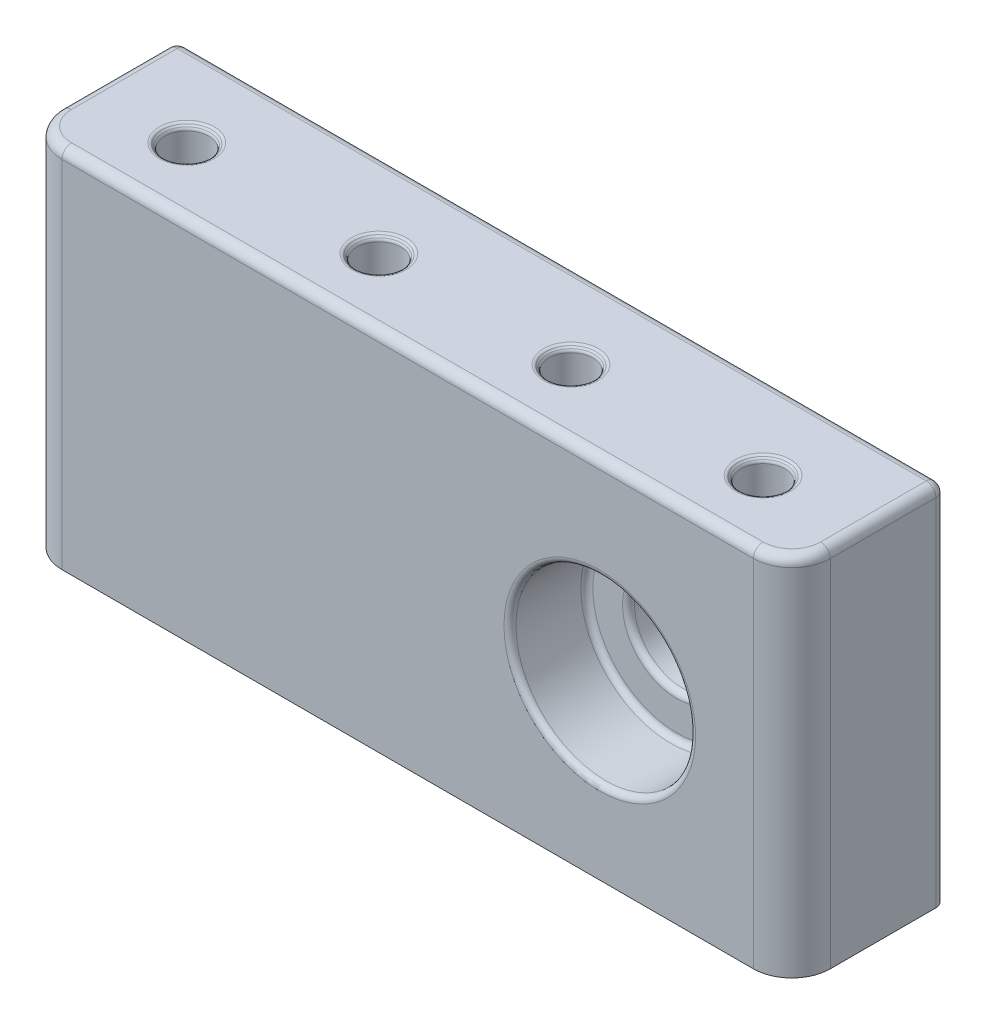
ISO-10303-21;
HEADER;
FILE_DESCRIPTION(('STEP AP214'),'2;1');
FILE_NAME('part.step','',(''),(''),'','','');
FILE_SCHEMA(('AUTOMOTIVE_DESIGN { 1 0 10303 214 1 1 1 1 }'));
ENDSEC;
DATA;
#1=APPLICATION_CONTEXT('core data for automotive mechanical design processes');
#2=APPLICATION_PROTOCOL_DEFINITION('international standard','automotive_design',2000,#1);
#3=PRODUCT_CONTEXT('',#1,'mechanical');
#4=PRODUCT('Part','Part','',(#3));
#5=PRODUCT_RELATED_PRODUCT_CATEGORY('part','',(#4));
#6=PRODUCT_DEFINITION_FORMATION('','',#4);
#7=PRODUCT_DEFINITION_CONTEXT('part definition',#1,'design');
#8=PRODUCT_DEFINITION('design','',#6,#7);
#9=PRODUCT_DEFINITION_SHAPE('','',#8);
#10=(LENGTH_UNIT() NAMED_UNIT(*) SI_UNIT(.MILLI.,.METRE.));
#11=(NAMED_UNIT(*) PLANE_ANGLE_UNIT() SI_UNIT($,.RADIAN.));
#12=(NAMED_UNIT(*) SI_UNIT($,.STERADIAN.) SOLID_ANGLE_UNIT());
#13=UNCERTAINTY_MEASURE_WITH_UNIT(LENGTH_MEASURE(1.E-05),#10,'distance_accuracy_value','');
#14=(GEOMETRIC_REPRESENTATION_CONTEXT(3) GLOBAL_UNCERTAINTY_ASSIGNED_CONTEXT((#13)) GLOBAL_UNIT_ASSIGNED_CONTEXT((#10,
#11,#12)) REPRESENTATION_CONTEXT('',''));
#15=CARTESIAN_POINT('',(0.,0.,0.));
#16=DIRECTION('',(0.,0.,1.));
#17=DIRECTION('',(1.,0.,0.));
#18=AXIS2_PLACEMENT_3D('',#15,#16,#17);
#19=CARTESIAN_POINT('',(20.,-9.5,8.));
#20=DIRECTION('',(-1.,0.,0.));
#21=DIRECTION('',(0.,0.,1.));
#22=AXIS2_PLACEMENT_3D('',#19,#20,#21);
#23=PLANE('',#22);
#24=DIRECTION('',(0.,1.,0.));
#25=VECTOR('',#24,1.);
#26=CARTESIAN_POINT('',(20.,9.5,0.5));
#27=LINE('',#26,#25);
#28=CARTESIAN_POINT('',(20.,-9.5,0.5));
#29=VERTEX_POINT('',#28);
#30=CARTESIAN_POINT('',(20.,9.,0.5));
#31=VERTEX_POINT('',#30);
#32=EDGE_CURVE('E248',#29,#31,#27,.T.);
#33=ORIENTED_EDGE('',*,*,#32,.T.);
#34=DIRECTION('',(0.,0.,-1.));
#35=VECTOR('',#34,1.);
#36=CARTESIAN_POINT('',(20.,9.,8.));
#37=LINE('',#36,#35);
#38=CARTESIAN_POINT('',(20.,9.,6.));
#39=VERTEX_POINT('',#38);
#40=EDGE_CURVE('E250',#31,#39,#37,.F.);
#41=ORIENTED_EDGE('',*,*,#40,.T.);
#42=DIRECTION('',(0.,1.,0.));
#43=VECTOR('',#42,1.);
#44=CARTESIAN_POINT('',(20.,-9.5,6.));
#45=LINE('',#44,#43);
#46=CARTESIAN_POINT('',(20.,-9.5,6.));
#47=VERTEX_POINT('',#46);
#48=EDGE_CURVE('E144',#39,#47,#45,.F.);
#49=ORIENTED_EDGE('',*,*,#48,.T.);
#50=DIRECTION('',(0.,0.,-1.));
#51=VECTOR('',#50,1.);
#52=CARTESIAN_POINT('',(20.,-9.5,8.));
#53=LINE('',#52,#51);
#54=EDGE_CURVE('E150',#47,#29,#53,.T.);
#55=ORIENTED_EDGE('',*,*,#54,.T.);
#56=EDGE_LOOP('',(#33,#41,#49,#55));
#57=FACE_BOUND('',#56,.T.);
#58=ADVANCED_FACE('F38',(#57),#23,.F.);
#59=CARTESIAN_POINT('',(-20.,9.5,8.));
#60=DIRECTION('',(0.,-1.,0.));
#61=DIRECTION('',(0.,0.,-1.));
#62=AXIS2_PLACEMENT_3D('',#59,#60,#61);
#63=PLANE('',#62);
#64=CARTESIAN_POINT('',(-18.,9.5,6.));
#65=DIRECTION('',(0.,-1.,0.));
#66=DIRECTION('',(0.,0.,-1.));
#67=AXIS2_PLACEMENT_3D('',#64,#65,#66);
#68=CIRCLE('',#67,1.5);
#69=CARTESIAN_POINT('',(-19.5,9.5,6.));
#70=VERTEX_POINT('',#69);
#71=CARTESIAN_POINT('',(-18.,9.5,7.5));
#72=VERTEX_POINT('',#71);
#73=EDGE_CURVE('E242',#70,#72,#68,.F.);
#74=ORIENTED_EDGE('',*,*,#73,.T.);
#75=DIRECTION('',(-1.,0.,0.));
#76=VECTOR('',#75,1.);
#77=CARTESIAN_POINT('',(-20.,9.5,7.5));
#78=LINE('',#77,#76);
#79=CARTESIAN_POINT('',(18.,9.5,7.5));
#80=VERTEX_POINT('',#79);
#81=EDGE_CURVE('E246',#72,#80,#78,.F.);
#82=ORIENTED_EDGE('',*,*,#81,.T.);
#83=CARTESIAN_POINT('',(18.,9.5,6.));
#84=DIRECTION('',(0.,-1.,0.));
#85=DIRECTION('',(0.,0.,-1.));
#86=AXIS2_PLACEMENT_3D('',#83,#84,#85);
#87=CIRCLE('',#86,1.5);
#88=CARTESIAN_POINT('',(19.5,9.5,6.));
#89=VERTEX_POINT('',#88);
#90=EDGE_CURVE('E244',#80,#89,#87,.F.);
#91=ORIENTED_EDGE('',*,*,#90,.T.);
#92=DIRECTION('',(0.,0.,-1.));
#93=VECTOR('',#92,1.);
#94=CARTESIAN_POINT('',(19.5,9.5,8.));
#95=LINE('',#94,#93);
#96=CARTESIAN_POINT('',(19.5,9.5,0.5));
#97=VERTEX_POINT('',#96);
#98=EDGE_CURVE('E239',#89,#97,#95,.T.);
#99=ORIENTED_EDGE('',*,*,#98,.T.);
#100=DIRECTION('',(-1.,0.,0.));
#101=VECTOR('',#100,1.);
#102=CARTESIAN_POINT('',(-20.,9.5,0.5));
#103=LINE('',#102,#101);
#104=CARTESIAN_POINT('',(-19.5,9.5,0.5));
#105=VERTEX_POINT('',#104);
#106=EDGE_CURVE('E235',#97,#105,#103,.T.);
#107=ORIENTED_EDGE('',*,*,#106,.T.);
#108=DIRECTION('',(0.,0.,-1.));
#109=VECTOR('',#108,1.);
#110=CARTESIAN_POINT('',(-19.5,9.5,8.));
#111=LINE('',#110,#109);
#112=EDGE_CURVE('E237',#105,#70,#111,.F.);
#113=ORIENTED_EDGE('',*,*,#112,.T.);
#114=EDGE_LOOP('',(#74,#82,#91,#99,#107,#113));
#115=FACE_BOUND('',#114,.T.);
#116=CARTESIAN_POINT('',(-15.,9.5,4.5));
#117=DIRECTION('',(0.,-1.,0.));
#118=DIRECTION('',(0.,0.,-1.));
#119=AXIS2_PLACEMENT_3D('',#116,#117,#118);
#120=CIRCLE('',#119,1.43284271247463);
#121=CARTESIAN_POINT('',(-15.,9.5,3.06715728752537));
#122=VERTEX_POINT('',#121);
#123=EDGE_CURVE('E196',#122,#122,#120,.T.);
#124=ORIENTED_EDGE('',*,*,#123,.T.);
#125=EDGE_LOOP('',(#124));
#126=FACE_BOUND('',#125,.T.);
#127=CARTESIAN_POINT('',(-5.,9.5,4.5));
#128=DIRECTION('',(0.,-1.,0.));
#129=DIRECTION('',(0.,0.,-1.));
#130=AXIS2_PLACEMENT_3D('',#127,#128,#129);
#131=CIRCLE('',#130,1.43284271247463);
#132=CARTESIAN_POINT('',(-5.,9.5,3.06715728752537));
#133=VERTEX_POINT('',#132);
#134=EDGE_CURVE('E193',#133,#133,#131,.T.);
#135=ORIENTED_EDGE('',*,*,#134,.T.);
#136=EDGE_LOOP('',(#135));
#137=FACE_BOUND('',#136,.T.);
#138=CARTESIAN_POINT('',(5.,9.5,4.5));
#139=DIRECTION('',(0.,-1.,0.));
#140=DIRECTION('',(0.,0.,-1.));
#141=AXIS2_PLACEMENT_3D('',#138,#139,#140);
#142=CIRCLE('',#141,1.43284271247463);
#143=CARTESIAN_POINT('',(5.,9.5,3.06715728752537));
#144=VERTEX_POINT('',#143);
#145=EDGE_CURVE('E190',#144,#144,#142,.T.);
#146=ORIENTED_EDGE('',*,*,#145,.T.);
#147=EDGE_LOOP('',(#146));
#148=FACE_BOUND('',#147,.T.);
#149=CARTESIAN_POINT('',(15.,9.5,4.5));
#150=DIRECTION('',(0.,-1.,0.));
#151=DIRECTION('',(0.,0.,-1.));
#152=AXIS2_PLACEMENT_3D('',#149,#150,#151);
#153=CIRCLE('',#152,1.43284271247463);
#154=CARTESIAN_POINT('',(15.,9.5,3.06715728752537));
#155=VERTEX_POINT('',#154);
#156=EDGE_CURVE('E187',#155,#155,#153,.T.);
#157=ORIENTED_EDGE('',*,*,#156,.T.);
#158=EDGE_LOOP('',(#157));
#159=FACE_BOUND('',#158,.T.);
#160=ADVANCED_FACE('F356',(#115,#126,#137,#148,#159),#63,.F.);
#161=CARTESIAN_POINT('',(-20.,-9.5,8.));
#162=DIRECTION('',(1.,0.,0.));
#163=DIRECTION('',(0.,0.,-1.));
#164=AXIS2_PLACEMENT_3D('',#161,#162,#163);
#165=PLANE('',#164);
#166=DIRECTION('',(0.,-1.,0.));
#167=VECTOR('',#166,1.);
#168=CARTESIAN_POINT('',(-20.,-9.5,6.));
#169=LINE('',#168,#167);
#170=CARTESIAN_POINT('',(-20.,-9.5,6.));
#171=VERTEX_POINT('',#170);
#172=CARTESIAN_POINT('',(-20.,9.,6.));
#173=VERTEX_POINT('',#172);
#174=EDGE_CURVE('E139',#171,#173,#169,.F.);
#175=ORIENTED_EDGE('',*,*,#174,.T.);
#176=DIRECTION('',(0.,0.,-1.));
#177=VECTOR('',#176,1.);
#178=CARTESIAN_POINT('',(-20.,9.,8.));
#179=LINE('',#178,#177);
#180=CARTESIAN_POINT('',(-20.,9.,0.5));
#181=VERTEX_POINT('',#180);
#182=EDGE_CURVE('E257',#173,#181,#179,.T.);
#183=ORIENTED_EDGE('',*,*,#182,.T.);
#184=DIRECTION('',(0.,-1.,0.));
#185=VECTOR('',#184,1.);
#186=CARTESIAN_POINT('',(-20.,-9.5,0.5));
#187=LINE('',#186,#185);
#188=CARTESIAN_POINT('',(-20.,-9.5,0.5));
#189=VERTEX_POINT('',#188);
#190=EDGE_CURVE('E255',#181,#189,#187,.T.);
#191=ORIENTED_EDGE('',*,*,#190,.T.);
#192=DIRECTION('',(0.,0.,-1.));
#193=VECTOR('',#192,1.);
#194=CARTESIAN_POINT('',(-20.,-9.5,8.));
#195=LINE('',#194,#193);
#196=EDGE_CURVE('E133',#171,#189,#195,.T.);
#197=ORIENTED_EDGE('',*,*,#196,.F.);
#198=EDGE_LOOP('',(#175,#183,#191,#197));
#199=FACE_BOUND('',#198,.T.);
#200=ADVANCED_FACE('F362',(#199),#165,.F.);
#201=CARTESIAN_POINT('',(-20.,-9.5,8.));
#202=DIRECTION('',(0.,1.,0.));
#203=DIRECTION('',(0.,0.,1.));
#204=AXIS2_PLACEMENT_3D('',#201,#202,#203);
#205=PLANE('',#204);
#206=DIRECTION('',(1.,0.,0.));
#207=VECTOR('',#206,1.);
#208=CARTESIAN_POINT('',(-20.,-9.5,0.));
#209=LINE('',#208,#207);
#210=CARTESIAN_POINT('',(-19.5,-9.5,0.));
#211=VERTEX_POINT('',#210);
#212=CARTESIAN_POINT('',(19.5,-9.5,0.));
#213=VERTEX_POINT('',#212);
#214=EDGE_CURVE('E151',#211,#213,#209,.T.);
#215=ORIENTED_EDGE('',*,*,#214,.T.);
#216=CARTESIAN_POINT('',(19.5,-9.5,0.5));
#217=DIRECTION('',(0.,1.,0.));
#218=DIRECTION('',(0.,0.,1.));
#219=AXIS2_PLACEMENT_3D('',#216,#217,#218);
#220=CIRCLE('',#219,0.5);
#221=EDGE_CURVE('E268',#213,#29,#220,.F.);
#222=ORIENTED_EDGE('',*,*,#221,.T.);
#223=ORIENTED_EDGE('',*,*,#54,.F.);
#224=CARTESIAN_POINT('',(18.,-9.5,6.));
#225=DIRECTION('',(0.,1.,0.));
#226=DIRECTION('',(0.,0.,1.));
#227=AXIS2_PLACEMENT_3D('',#224,#225,#226);
#228=CIRCLE('',#227,2.);
#229=CARTESIAN_POINT('',(18.,-9.5,8.));
#230=VERTEX_POINT('',#229);
#231=EDGE_CURVE('E143',#47,#230,#228,.F.);
#232=ORIENTED_EDGE('',*,*,#231,.T.);
#233=DIRECTION('',(1.,0.,0.));
#234=VECTOR('',#233,1.);
#235=CARTESIAN_POINT('',(-20.,-9.5,8.));
#236=LINE('',#235,#234);
#237=CARTESIAN_POINT('',(-18.,-9.5,8.));
#238=VERTEX_POINT('',#237);
#239=EDGE_CURVE('E126',#238,#230,#236,.T.);
#240=ORIENTED_EDGE('',*,*,#239,.F.);
#241=CARTESIAN_POINT('',(-18.,-9.5,6.));
#242=DIRECTION('',(0.,1.,0.));
#243=DIRECTION('',(0.,0.,1.));
#244=AXIS2_PLACEMENT_3D('',#241,#242,#243);
#245=CIRCLE('',#244,2.);
#246=EDGE_CURVE('E136',#238,#171,#245,.F.);
#247=ORIENTED_EDGE('',*,*,#246,.T.);
#248=ORIENTED_EDGE('',*,*,#196,.T.);
#249=CARTESIAN_POINT('',(-19.5,-9.5,0.5));
#250=DIRECTION('',(0.,1.,0.));
#251=DIRECTION('',(0.,0.,1.));
#252=AXIS2_PLACEMENT_3D('',#249,#250,#251);
#253=CIRCLE('',#252,0.5);
#254=EDGE_CURVE('E266',#189,#211,#253,.F.);
#255=ORIENTED_EDGE('',*,*,#254,.T.);
#256=EDGE_LOOP('',(#215,#222,#223,#232,#240,#247,#248,#255));
#257=FACE_BOUND('',#256,.T.);
#258=ADVANCED_FACE('F147',(#257),#205,.F.);
#259=CARTESIAN_POINT('',(0.,0.,8.));
#260=DIRECTION('',(0.,0.,-1.));
#261=DIRECTION('',(-1.,0.,0.));
#262=AXIS2_PLACEMENT_3D('',#259,#260,#261);
#263=PLANE('',#262);
#264=CARTESIAN_POINT('',(10.,-0.499999999999999,8.));
#265=DIRECTION('',(0.,0.,-1.));
#266=DIRECTION('',(-1.,0.,0.));
#267=AXIS2_PLACEMENT_3D('',#264,#265,#266);
#268=CIRCLE('',#267,4.9875);
#269=CARTESIAN_POINT('',(5.01250000000001,-0.499999999999999,8.));
#270=VERTEX_POINT('',#269);
#271=EDGE_CURVE('E11',#270,#270,#268,.T.);
#272=ORIENTED_EDGE('',*,*,#271,.T.);
#273=EDGE_LOOP('',(#272));
#274=FACE_BOUND('',#273,.T.);
#275=DIRECTION('',(0.,1.,0.));
#276=VECTOR('',#275,1.);
#277=CARTESIAN_POINT('',(18.,0.,8.));
#278=LINE('',#277,#276);
#279=CARTESIAN_POINT('',(18.,9.,8.));
#280=VERTEX_POINT('',#279);
#281=EDGE_CURVE('E132',#230,#280,#278,.T.);
#282=ORIENTED_EDGE('',*,*,#281,.T.);
#283=DIRECTION('',(-1.,0.,0.));
#284=VECTOR('',#283,1.);
#285=CARTESIAN_POINT('',(0.,9.,8.));
#286=LINE('',#285,#284);
#287=CARTESIAN_POINT('',(-18.,9.,8.));
#288=VERTEX_POINT('',#287);
#289=EDGE_CURVE('E129',#280,#288,#286,.T.);
#290=ORIENTED_EDGE('',*,*,#289,.T.);
#291=DIRECTION('',(0.,-1.,0.));
#292=VECTOR('',#291,1.);
#293=CARTESIAN_POINT('',(-18.,0.,8.));
#294=LINE('',#293,#292);
#295=EDGE_CURVE('E121',#288,#238,#294,.T.);
#296=ORIENTED_EDGE('',*,*,#295,.T.);
#297=ORIENTED_EDGE('',*,*,#239,.T.);
#298=EDGE_LOOP('',(#282,#290,#296,#297));
#299=FACE_BOUND('',#298,.T.);
#300=ADVANCED_FACE('F124',(#274,#299),#263,.F.);
#301=CARTESIAN_POINT('',(0.,0.,0.));
#302=DIRECTION('',(0.,0.,-1.));
#303=DIRECTION('',(-1.,0.,0.));
#304=AXIS2_PLACEMENT_3D('',#301,#302,#303);
#305=PLANE('',#304);
#306=CARTESIAN_POINT('',(10.,-0.499999999999999,0.));
#307=DIRECTION('',(0.,0.,-1.));
#308=DIRECTION('',(-1.,0.,0.));
#309=AXIS2_PLACEMENT_3D('',#306,#307,#308);
#310=CIRCLE('',#309,4.1294417382416);
#311=CARTESIAN_POINT('',(5.87055826175841,-0.499999999999999,0.));
#312=VERTEX_POINT('',#311);
#313=EDGE_CURVE('E270',#312,#312,#310,.F.);
#314=ORIENTED_EDGE('',*,*,#313,.T.);
#315=EDGE_LOOP('',(#314));
#316=FACE_BOUND('',#315,.T.);
#317=DIRECTION('',(-1.,0.,0.));
#318=VECTOR('',#317,1.);
#319=CARTESIAN_POINT('',(20.,9.,0.));
#320=LINE('',#319,#318);
#321=CARTESIAN_POINT('',(-19.5,9.,0.));
#322=VERTEX_POINT('',#321);
#323=CARTESIAN_POINT('',(19.5,9.,0.));
#324=VERTEX_POINT('',#323);
#325=EDGE_CURVE('E53',#322,#324,#320,.F.);
#326=ORIENTED_EDGE('',*,*,#325,.T.);
#327=DIRECTION('',(0.,1.,0.));
#328=VECTOR('',#327,1.);
#329=CARTESIAN_POINT('',(19.5,-9.5,0.));
#330=LINE('',#329,#328);
#331=EDGE_CURVE('E264',#324,#213,#330,.F.);
#332=ORIENTED_EDGE('',*,*,#331,.T.);
#333=ORIENTED_EDGE('',*,*,#214,.F.);
#334=DIRECTION('',(0.,-1.,0.));
#335=VECTOR('',#334,1.);
#336=CARTESIAN_POINT('',(-19.5,9.5,0.));
#337=LINE('',#336,#335);
#338=EDGE_CURVE('E58',#211,#322,#337,.F.);
#339=ORIENTED_EDGE('',*,*,#338,.T.);
#340=EDGE_LOOP('',(#326,#332,#333,#339));
#341=FACE_BOUND('',#340,.T.);
#342=ADVANCED_FACE('F370',(#316,#341),#305,.T.);
#343=CARTESIAN_POINT('',(18.,0.,6.));
#344=DIRECTION('',(0.,1.,0.));
#345=DIRECTION('',(0.,0.,1.));
#346=AXIS2_PLACEMENT_3D('',#343,#344,#345);
#347=CYLINDRICAL_SURFACE('',#346,2.);
#348=ORIENTED_EDGE('',*,*,#48,.F.);
#349=CARTESIAN_POINT('',(18.,9.,6.));
#350=DIRECTION('',(0.,-1.,0.));
#351=DIRECTION('',(0.,0.,-1.));
#352=AXIS2_PLACEMENT_3D('',#349,#350,#351);
#353=CIRCLE('',#352,2.);
#354=EDGE_CURVE('E253',#39,#280,#353,.T.);
#355=ORIENTED_EDGE('',*,*,#354,.T.);
#356=ORIENTED_EDGE('',*,*,#281,.F.);
#357=ORIENTED_EDGE('',*,*,#231,.F.);
#358=EDGE_LOOP('',(#348,#355,#356,#357));
#359=FACE_BOUND('',#358,.T.);
#360=ADVANCED_FACE('F367',(#359),#347,.T.);
#361=CARTESIAN_POINT('',(-18.,0.,6.));
#362=DIRECTION('',(0.,-1.,0.));
#363=DIRECTION('',(0.,0.,-1.));
#364=AXIS2_PLACEMENT_3D('',#361,#362,#363);
#365=CYLINDRICAL_SURFACE('',#364,2.);
#366=ORIENTED_EDGE('',*,*,#295,.F.);
#367=CARTESIAN_POINT('',(-18.,9.,6.));
#368=DIRECTION('',(0.,-1.,0.));
#369=DIRECTION('',(0.,0.,-1.));
#370=AXIS2_PLACEMENT_3D('',#367,#368,#369);
#371=CIRCLE('',#370,2.);
#372=EDGE_CURVE('E259',#288,#173,#371,.T.);
#373=ORIENTED_EDGE('',*,*,#372,.T.);
#374=ORIENTED_EDGE('',*,*,#174,.F.);
#375=ORIENTED_EDGE('',*,*,#246,.F.);
#376=EDGE_LOOP('',(#366,#373,#374,#375));
#377=FACE_BOUND('',#376,.T.);
#378=ADVANCED_FACE('F137',(#377),#365,.T.);
#379=CARTESIAN_POINT('',(15.,2.5,4.5));
#380=DIRECTION('',(0.,1.,0.));
#381=DIRECTION('',(0.,0.,1.));
#382=AXIS2_PLACEMENT_3D('',#379,#380,#381);
#383=CYLINDRICAL_SURFACE('',#382,1.15);
#384=CARTESIAN_POINT('',(15.,9.21715728752537,4.5));
#385=DIRECTION('',(0.,-1.,0.));
#386=DIRECTION('',(0.,0.,-1.));
#387=AXIS2_PLACEMENT_3D('',#384,#385,#386);
#388=CIRCLE('',#387,1.15);
#389=CARTESIAN_POINT('',(15.,9.21715728752537,3.35));
#390=VERTEX_POINT('',#389);
#391=EDGE_CURVE('E232',#390,#390,#388,.F.);
#392=ORIENTED_EDGE('',*,*,#391,.T.);
#393=EDGE_LOOP('',(#392));
#394=FACE_BOUND('',#393,.T.);
#395=CARTESIAN_POINT('',(15.,2.70000000000001,4.5));
#396=DIRECTION('',(0.,1.,0.));
#397=DIRECTION('',(0.,0.,1.));
#398=AXIS2_PLACEMENT_3D('',#395,#396,#397);
#399=CIRCLE('',#398,1.15);
#400=CARTESIAN_POINT('',(15.,2.70000000000001,5.65));
#401=VERTEX_POINT('',#400);
#402=EDGE_CURVE('E163',#401,#401,#399,.F.);
#403=ORIENTED_EDGE('',*,*,#402,.T.);
#404=EDGE_LOOP('',(#403));
#405=FACE_BOUND('',#404,.T.);
#406=ADVANCED_FACE('F374',(#394,#405),#383,.F.);
#407=CARTESIAN_POINT('',(15.,2.5,4.5));
#408=DIRECTION('',(0.,1.,0.));
#409=DIRECTION('',(0.,0.,1.));
#410=AXIS2_PLACEMENT_3D('',#407,#408,#409);
#411=PLANE('',#410);
#412=CARTESIAN_POINT('',(15.,2.5,4.5));
#413=DIRECTION('',(0.,1.,0.));
#414=DIRECTION('',(0.,0.,1.));
#415=AXIS2_PLACEMENT_3D('',#412,#413,#414);
#416=CIRCLE('',#415,0.949999999999986);
#417=CARTESIAN_POINT('',(15.,2.5,5.44999999999999));
#418=VERTEX_POINT('',#417);
#419=EDGE_CURVE('E166',#418,#418,#416,.T.);
#420=ORIENTED_EDGE('',*,*,#419,.T.);
#421=EDGE_LOOP('',(#420));
#422=FACE_BOUND('',#421,.T.);
#423=ADVANCED_FACE('F546',(#422),#411,.T.);
#424=CARTESIAN_POINT('',(5.,2.5,4.5));
#425=DIRECTION('',(0.,1.,0.));
#426=DIRECTION('',(0.,0.,1.));
#427=AXIS2_PLACEMENT_3D('',#424,#425,#426);
#428=CYLINDRICAL_SURFACE('',#427,1.15);
#429=CARTESIAN_POINT('',(5.,9.21715728752537,4.5));
#430=DIRECTION('',(0.,-1.,0.));
#431=DIRECTION('',(0.,0.,-1.));
#432=AXIS2_PLACEMENT_3D('',#429,#430,#431);
#433=CIRCLE('',#432,1.15);
#434=CARTESIAN_POINT('',(5.,9.21715728752537,3.35));
#435=VERTEX_POINT('',#434);
#436=EDGE_CURVE('E223',#435,#435,#433,.F.);
#437=ORIENTED_EDGE('',*,*,#436,.T.);
#438=EDGE_LOOP('',(#437));
#439=FACE_BOUND('',#438,.T.);
#440=CARTESIAN_POINT('',(5.,2.70000000000001,4.5));
#441=DIRECTION('',(0.,1.,0.));
#442=DIRECTION('',(0.,0.,1.));
#443=AXIS2_PLACEMENT_3D('',#440,#441,#442);
#444=CIRCLE('',#443,1.15);
#445=CARTESIAN_POINT('',(5.,2.70000000000001,5.65));
#446=VERTEX_POINT('',#445);
#447=EDGE_CURVE('E169',#446,#446,#444,.F.);
#448=ORIENTED_EDGE('',*,*,#447,.T.);
#449=EDGE_LOOP('',(#448));
#450=FACE_BOUND('',#449,.T.);
#451=ADVANCED_FACE('F542',(#439,#450),#428,.F.);
#452=CARTESIAN_POINT('',(5.,2.5,4.5));
#453=DIRECTION('',(0.,1.,0.));
#454=DIRECTION('',(0.,0.,1.));
#455=AXIS2_PLACEMENT_3D('',#452,#453,#454);
#456=PLANE('',#455);
#457=CARTESIAN_POINT('',(5.,2.5,4.5));
#458=DIRECTION('',(0.,1.,0.));
#459=DIRECTION('',(0.,0.,1.));
#460=AXIS2_PLACEMENT_3D('',#457,#458,#459);
#461=CIRCLE('',#460,0.949999999999986);
#462=CARTESIAN_POINT('',(5.,2.5,5.44999999999999));
#463=VERTEX_POINT('',#462);
#464=EDGE_CURVE('E172',#463,#463,#461,.T.);
#465=ORIENTED_EDGE('',*,*,#464,.T.);
#466=EDGE_LOOP('',(#465));
#467=FACE_BOUND('',#466,.T.);
#468=ADVANCED_FACE('F538',(#467),#456,.T.);
#469=CARTESIAN_POINT('',(-5.,2.5,4.5));
#470=DIRECTION('',(0.,1.,0.));
#471=DIRECTION('',(0.,0.,1.));
#472=AXIS2_PLACEMENT_3D('',#469,#470,#471);
#473=CYLINDRICAL_SURFACE('',#472,1.15);
#474=CARTESIAN_POINT('',(-5.,9.21715728752537,4.5));
#475=DIRECTION('',(0.,-1.,0.));
#476=DIRECTION('',(0.,0.,-1.));
#477=AXIS2_PLACEMENT_3D('',#474,#475,#476);
#478=CIRCLE('',#477,1.15);
#479=CARTESIAN_POINT('',(-5.,9.21715728752537,3.35));
#480=VERTEX_POINT('',#479);
#481=EDGE_CURVE('E214',#480,#480,#478,.F.);
#482=ORIENTED_EDGE('',*,*,#481,.T.);
#483=EDGE_LOOP('',(#482));
#484=FACE_BOUND('',#483,.T.);
#485=CARTESIAN_POINT('',(-5.,2.70000000000001,4.5));
#486=DIRECTION('',(0.,1.,0.));
#487=DIRECTION('',(0.,0.,1.));
#488=AXIS2_PLACEMENT_3D('',#485,#486,#487);
#489=CIRCLE('',#488,1.15);
#490=CARTESIAN_POINT('',(-5.,2.70000000000001,5.65));
#491=VERTEX_POINT('',#490);
#492=EDGE_CURVE('E175',#491,#491,#489,.F.);
#493=ORIENTED_EDGE('',*,*,#492,.T.);
#494=EDGE_LOOP('',(#493));
#495=FACE_BOUND('',#494,.T.);
#496=ADVANCED_FACE('F534',(#484,#495),#473,.F.);
#497=CARTESIAN_POINT('',(-5.,2.5,4.5));
#498=DIRECTION('',(0.,1.,0.));
#499=DIRECTION('',(0.,0.,1.));
#500=AXIS2_PLACEMENT_3D('',#497,#498,#499);
#501=PLANE('',#500);
#502=CARTESIAN_POINT('',(-5.,2.5,4.5));
#503=DIRECTION('',(0.,1.,0.));
#504=DIRECTION('',(0.,0.,1.));
#505=AXIS2_PLACEMENT_3D('',#502,#503,#504);
#506=CIRCLE('',#505,0.949999999999986);
#507=CARTESIAN_POINT('',(-5.,2.5,5.44999999999999));
#508=VERTEX_POINT('',#507);
#509=EDGE_CURVE('E178',#508,#508,#506,.T.);
#510=ORIENTED_EDGE('',*,*,#509,.T.);
#511=EDGE_LOOP('',(#510));
#512=FACE_BOUND('',#511,.T.);
#513=ADVANCED_FACE('F530',(#512),#501,.T.);
#514=CARTESIAN_POINT('',(-15.,2.5,4.5));
#515=DIRECTION('',(0.,1.,0.));
#516=DIRECTION('',(0.,0.,1.));
#517=AXIS2_PLACEMENT_3D('',#514,#515,#516);
#518=CYLINDRICAL_SURFACE('',#517,1.15);
#519=CARTESIAN_POINT('',(-15.,9.21715728752537,4.5));
#520=DIRECTION('',(0.,-1.,0.));
#521=DIRECTION('',(0.,0.,-1.));
#522=AXIS2_PLACEMENT_3D('',#519,#520,#521);
#523=CIRCLE('',#522,1.15);
#524=CARTESIAN_POINT('',(-15.,9.21715728752537,3.35));
#525=VERTEX_POINT('',#524);
#526=EDGE_CURVE('E205',#525,#525,#523,.F.);
#527=ORIENTED_EDGE('',*,*,#526,.T.);
#528=EDGE_LOOP('',(#527));
#529=FACE_BOUND('',#528,.T.);
#530=CARTESIAN_POINT('',(-15.,2.70000000000001,4.5));
#531=DIRECTION('',(0.,1.,0.));
#532=DIRECTION('',(0.,0.,1.));
#533=AXIS2_PLACEMENT_3D('',#530,#531,#532);
#534=CIRCLE('',#533,1.15);
#535=CARTESIAN_POINT('',(-15.,2.70000000000001,5.65));
#536=VERTEX_POINT('',#535);
#537=EDGE_CURVE('E181',#536,#536,#534,.F.);
#538=ORIENTED_EDGE('',*,*,#537,.T.);
#539=EDGE_LOOP('',(#538));
#540=FACE_BOUND('',#539,.T.);
#541=ADVANCED_FACE('F526',(#529,#540),#518,.F.);
#542=CARTESIAN_POINT('',(-15.,2.5,4.5));
#543=DIRECTION('',(0.,1.,0.));
#544=DIRECTION('',(0.,0.,1.));
#545=AXIS2_PLACEMENT_3D('',#542,#543,#544);
#546=PLANE('',#545);
#547=CARTESIAN_POINT('',(-15.,2.5,4.5));
#548=DIRECTION('',(0.,1.,0.));
#549=DIRECTION('',(0.,0.,1.));
#550=AXIS2_PLACEMENT_3D('',#547,#548,#549);
#551=CIRCLE('',#550,0.949999999999986);
#552=CARTESIAN_POINT('',(-15.,2.5,5.44999999999999));
#553=VERTEX_POINT('',#552);
#554=EDGE_CURVE('E184',#553,#553,#551,.T.);
#555=ORIENTED_EDGE('',*,*,#554,.T.);
#556=EDGE_LOOP('',(#555));
#557=FACE_BOUND('',#556,.T.);
#558=ADVANCED_FACE('F383',(#557),#546,.T.);
#559=CARTESIAN_POINT('',(15.,9.29999999999999,4.5));
#560=DIRECTION('',(0.,1.,0.));
#561=DIRECTION('',(0.,0.,1.));
#562=AXIS2_PLACEMENT_3D('',#559,#560,#561);
#563=CONICAL_SURFACE('',#562,1.15,0.785398163397457);
#564=CARTESIAN_POINT('',(15.,9.44142135623731,4.5));
#565=DIRECTION('',(0.,1.,0.));
#566=DIRECTION('',(0.,0.,1.));
#567=AXIS2_PLACEMENT_3D('',#564,#565,#566);
#568=CIRCLE('',#567,1.29142135623732);
#569=CARTESIAN_POINT('',(15.,9.44142135623731,5.79142135623732));
#570=VERTEX_POINT('',#569);
#571=EDGE_CURVE('E229',#570,#570,#568,.T.);
#572=ORIENTED_EDGE('',*,*,#571,.T.);
#573=EDGE_LOOP('',(#572));
#574=FACE_BOUND('',#573,.T.);
#575=CARTESIAN_POINT('',(15.,9.35857864376269,4.5));
#576=DIRECTION('',(0.,1.,0.));
#577=DIRECTION('',(0.,0.,1.));
#578=AXIS2_PLACEMENT_3D('',#575,#576,#577);
#579=CIRCLE('',#578,1.20857864376269);
#580=CARTESIAN_POINT('',(15.,9.35857864376269,5.70857864376269));
#581=VERTEX_POINT('',#580);
#582=EDGE_CURVE('E226',#581,#581,#579,.F.);
#583=ORIENTED_EDGE('',*,*,#582,.T.);
#584=EDGE_LOOP('',(#583));
#585=FACE_BOUND('',#584,.T.);
#586=ADVANCED_FACE('F376',(#574,#585),#563,.F.);
#587=CARTESIAN_POINT('',(15.,2.5,4.5));
#588=DIRECTION('',(0.,1.,0.));
#589=DIRECTION('',(0.,0.,1.));
#590=AXIS2_PLACEMENT_3D('',#587,#588,#589);
#591=CONICAL_SURFACE('',#590,0.949999999999986,0.785398163397466);
#592=ORIENTED_EDGE('',*,*,#402,.F.);
#593=EDGE_LOOP('',(#592));
#594=FACE_BOUND('',#593,.T.);
#595=ORIENTED_EDGE('',*,*,#419,.F.);
#596=EDGE_LOOP('',(#595));
#597=FACE_BOUND('',#596,.T.);
#598=ADVANCED_FACE('F382',(#594,#597),#591,.F.);
#599=CARTESIAN_POINT('',(5.,9.29999999999999,4.5));
#600=DIRECTION('',(0.,1.,0.));
#601=DIRECTION('',(0.,0.,1.));
#602=AXIS2_PLACEMENT_3D('',#599,#600,#601);
#603=CONICAL_SURFACE('',#602,1.15,0.785398163397457);
#604=CARTESIAN_POINT('',(5.,9.44142135623731,4.5));
#605=DIRECTION('',(0.,1.,0.));
#606=DIRECTION('',(0.,0.,1.));
#607=AXIS2_PLACEMENT_3D('',#604,#605,#606);
#608=CIRCLE('',#607,1.29142135623732);
#609=CARTESIAN_POINT('',(5.,9.44142135623731,5.79142135623732));
#610=VERTEX_POINT('',#609);
#611=EDGE_CURVE('E220',#610,#610,#608,.T.);
#612=ORIENTED_EDGE('',*,*,#611,.T.);
#613=EDGE_LOOP('',(#612));
#614=FACE_BOUND('',#613,.T.);
#615=CARTESIAN_POINT('',(5.,9.35857864376269,4.5));
#616=DIRECTION('',(0.,1.,0.));
#617=DIRECTION('',(0.,0.,1.));
#618=AXIS2_PLACEMENT_3D('',#615,#616,#617);
#619=CIRCLE('',#618,1.20857864376269);
#620=CARTESIAN_POINT('',(5.,9.35857864376269,5.70857864376269));
#621=VERTEX_POINT('',#620);
#622=EDGE_CURVE('E217',#621,#621,#619,.F.);
#623=ORIENTED_EDGE('',*,*,#622,.T.);
#624=EDGE_LOOP('',(#623));
#625=FACE_BOUND('',#624,.T.);
#626=ADVANCED_FACE('F390',(#614,#625),#603,.F.);
#627=CARTESIAN_POINT('',(5.,2.5,4.5));
#628=DIRECTION('',(0.,1.,0.));
#629=DIRECTION('',(0.,0.,1.));
#630=AXIS2_PLACEMENT_3D('',#627,#628,#629);
#631=CONICAL_SURFACE('',#630,0.949999999999986,0.785398163397466);
#632=ORIENTED_EDGE('',*,*,#447,.F.);
#633=EDGE_LOOP('',(#632));
#634=FACE_BOUND('',#633,.T.);
#635=ORIENTED_EDGE('',*,*,#464,.F.);
#636=EDGE_LOOP('',(#635));
#637=FACE_BOUND('',#636,.T.);
#638=ADVANCED_FACE('F397',(#634,#637),#631,.F.);
#639=CARTESIAN_POINT('',(-5.,9.29999999999999,4.5));
#640=DIRECTION('',(0.,1.,0.));
#641=DIRECTION('',(0.,0.,1.));
#642=AXIS2_PLACEMENT_3D('',#639,#640,#641);
#643=CONICAL_SURFACE('',#642,1.15,0.785398163397457);
#644=CARTESIAN_POINT('',(-5.,9.44142135623731,4.5));
#645=DIRECTION('',(0.,1.,0.));
#646=DIRECTION('',(0.,0.,1.));
#647=AXIS2_PLACEMENT_3D('',#644,#645,#646);
#648=CIRCLE('',#647,1.29142135623732);
#649=CARTESIAN_POINT('',(-5.,9.44142135623731,5.79142135623732));
#650=VERTEX_POINT('',#649);
#651=EDGE_CURVE('E211',#650,#650,#648,.T.);
#652=ORIENTED_EDGE('',*,*,#651,.T.);
#653=EDGE_LOOP('',(#652));
#654=FACE_BOUND('',#653,.T.);
#655=CARTESIAN_POINT('',(-5.,9.35857864376269,4.5));
#656=DIRECTION('',(0.,1.,0.));
#657=DIRECTION('',(0.,0.,1.));
#658=AXIS2_PLACEMENT_3D('',#655,#656,#657);
#659=CIRCLE('',#658,1.20857864376269);
#660=CARTESIAN_POINT('',(-5.,9.35857864376269,5.70857864376269));
#661=VERTEX_POINT('',#660);
#662=EDGE_CURVE('E208',#661,#661,#659,.F.);
#663=ORIENTED_EDGE('',*,*,#662,.T.);
#664=EDGE_LOOP('',(#663));
#665=FACE_BOUND('',#664,.T.);
#666=ADVANCED_FACE('F404',(#654,#665),#643,.F.);
#667=CARTESIAN_POINT('',(-5.,2.5,4.5));
#668=DIRECTION('',(0.,1.,0.));
#669=DIRECTION('',(0.,0.,1.));
#670=AXIS2_PLACEMENT_3D('',#667,#668,#669);
#671=CONICAL_SURFACE('',#670,0.949999999999986,0.785398163397466);
#672=ORIENTED_EDGE('',*,*,#492,.F.);
#673=EDGE_LOOP('',(#672));
#674=FACE_BOUND('',#673,.T.);
#675=ORIENTED_EDGE('',*,*,#509,.F.);
#676=EDGE_LOOP('',(#675));
#677=FACE_BOUND('',#676,.T.);
#678=ADVANCED_FACE('F411',(#674,#677),#671,.F.);
#679=CARTESIAN_POINT('',(-15.,9.29999999999999,4.5));
#680=DIRECTION('',(0.,1.,0.));
#681=DIRECTION('',(0.,0.,1.));
#682=AXIS2_PLACEMENT_3D('',#679,#680,#681);
#683=CONICAL_SURFACE('',#682,1.15,0.785398163397457);
#684=CARTESIAN_POINT('',(-15.,9.44142135623731,4.5));
#685=DIRECTION('',(0.,1.,0.));
#686=DIRECTION('',(0.,0.,1.));
#687=AXIS2_PLACEMENT_3D('',#684,#685,#686);
#688=CIRCLE('',#687,1.29142135623732);
#689=CARTESIAN_POINT('',(-15.,9.44142135623731,5.79142135623732));
#690=VERTEX_POINT('',#689);
#691=EDGE_CURVE('E202',#690,#690,#688,.T.);
#692=ORIENTED_EDGE('',*,*,#691,.T.);
#693=EDGE_LOOP('',(#692));
#694=FACE_BOUND('',#693,.T.);
#695=CARTESIAN_POINT('',(-15.,9.35857864376269,4.5));
#696=DIRECTION('',(0.,1.,0.));
#697=DIRECTION('',(0.,0.,1.));
#698=AXIS2_PLACEMENT_3D('',#695,#696,#697);
#699=CIRCLE('',#698,1.20857864376269);
#700=CARTESIAN_POINT('',(-15.,9.35857864376269,5.70857864376269));
#701=VERTEX_POINT('',#700);
#702=EDGE_CURVE('E199',#701,#701,#699,.F.);
#703=ORIENTED_EDGE('',*,*,#702,.T.);
#704=EDGE_LOOP('',(#703));
#705=FACE_BOUND('',#704,.T.);
#706=ADVANCED_FACE('F418',(#694,#705),#683,.F.);
#707=CARTESIAN_POINT('',(-15.,2.5,4.5));
#708=DIRECTION('',(0.,1.,0.));
#709=DIRECTION('',(0.,0.,1.));
#710=AXIS2_PLACEMENT_3D('',#707,#708,#709);
#711=CONICAL_SURFACE('',#710,0.949999999999986,0.785398163397466);
#712=ORIENTED_EDGE('',*,*,#537,.F.);
#713=EDGE_LOOP('',(#712));
#714=FACE_BOUND('',#713,.T.);
#715=ORIENTED_EDGE('',*,*,#554,.F.);
#716=EDGE_LOOP('',(#715));
#717=FACE_BOUND('',#716,.T.);
#718=ADVANCED_FACE('F425',(#714,#717),#711,.F.);
#719=CARTESIAN_POINT('',(-15.,9.3,4.5));
#720=DIRECTION('',(0.,-1.,0.));
#721=DIRECTION('',(0.,0.,-1.));
#722=AXIS2_PLACEMENT_3D('',#719,#720,#721);
#723=TOROIDAL_SURFACE('',#722,1.43284271247463,0.2);
#724=ORIENTED_EDGE('',*,*,#691,.F.);
#725=EDGE_LOOP('',(#724));
#726=FACE_BOUND('',#725,.T.);
#727=ORIENTED_EDGE('',*,*,#123,.F.);
#728=EDGE_LOOP('',(#727));
#729=FACE_BOUND('',#728,.T.);
#730=ADVANCED_FACE('F432',(#726,#729),#723,.T.);
#731=CARTESIAN_POINT('',(-15.,9.21715728752537,4.5));
#732=DIRECTION('',(0.,-1.,0.));
#733=DIRECTION('',(0.,0.,-1.));
#734=AXIS2_PLACEMENT_3D('',#731,#732,#733);
#735=TOROIDAL_SURFACE('',#734,1.35,0.2);
#736=ORIENTED_EDGE('',*,*,#702,.F.);
#737=EDGE_LOOP('',(#736));
#738=FACE_BOUND('',#737,.T.);
#739=ORIENTED_EDGE('',*,*,#526,.F.);
#740=EDGE_LOOP('',(#739));
#741=FACE_BOUND('',#740,.T.);
#742=ADVANCED_FACE('F436',(#738,#741),#735,.T.);
#743=CARTESIAN_POINT('',(-5.,9.3,4.5));
#744=DIRECTION('',(0.,-1.,0.));
#745=DIRECTION('',(0.,0.,-1.));
#746=AXIS2_PLACEMENT_3D('',#743,#744,#745);
#747=TOROIDAL_SURFACE('',#746,1.43284271247463,0.2);
#748=ORIENTED_EDGE('',*,*,#651,.F.);
#749=EDGE_LOOP('',(#748));
#750=FACE_BOUND('',#749,.T.);
#751=ORIENTED_EDGE('',*,*,#134,.F.);
#752=EDGE_LOOP('',(#751));
#753=FACE_BOUND('',#752,.T.);
#754=ADVANCED_FACE('F440',(#750,#753),#747,.T.);
#755=CARTESIAN_POINT('',(-5.,9.21715728752537,4.5));
#756=DIRECTION('',(0.,-1.,0.));
#757=DIRECTION('',(0.,0.,-1.));
#758=AXIS2_PLACEMENT_3D('',#755,#756,#757);
#759=TOROIDAL_SURFACE('',#758,1.35,0.2);
#760=ORIENTED_EDGE('',*,*,#662,.F.);
#761=EDGE_LOOP('',(#760));
#762=FACE_BOUND('',#761,.T.);
#763=ORIENTED_EDGE('',*,*,#481,.F.);
#764=EDGE_LOOP('',(#763));
#765=FACE_BOUND('',#764,.T.);
#766=ADVANCED_FACE('F444',(#762,#765),#759,.T.);
#767=CARTESIAN_POINT('',(5.,9.3,4.5));
#768=DIRECTION('',(0.,-1.,0.));
#769=DIRECTION('',(0.,0.,-1.));
#770=AXIS2_PLACEMENT_3D('',#767,#768,#769);
#771=TOROIDAL_SURFACE('',#770,1.43284271247463,0.2);
#772=ORIENTED_EDGE('',*,*,#611,.F.);
#773=EDGE_LOOP('',(#772));
#774=FACE_BOUND('',#773,.T.);
#775=ORIENTED_EDGE('',*,*,#145,.F.);
#776=EDGE_LOOP('',(#775));
#777=FACE_BOUND('',#776,.T.);
#778=ADVANCED_FACE('F448',(#774,#777),#771,.T.);
#779=CARTESIAN_POINT('',(5.,9.21715728752537,4.5));
#780=DIRECTION('',(0.,-1.,0.));
#781=DIRECTION('',(0.,0.,-1.));
#782=AXIS2_PLACEMENT_3D('',#779,#780,#781);
#783=TOROIDAL_SURFACE('',#782,1.35,0.2);
#784=ORIENTED_EDGE('',*,*,#622,.F.);
#785=EDGE_LOOP('',(#784));
#786=FACE_BOUND('',#785,.T.);
#787=ORIENTED_EDGE('',*,*,#436,.F.);
#788=EDGE_LOOP('',(#787));
#789=FACE_BOUND('',#788,.T.);
#790=ADVANCED_FACE('F452',(#786,#789),#783,.T.);
#791=CARTESIAN_POINT('',(15.,9.3,4.5));
#792=DIRECTION('',(0.,-1.,0.));
#793=DIRECTION('',(0.,0.,-1.));
#794=AXIS2_PLACEMENT_3D('',#791,#792,#793);
#795=TOROIDAL_SURFACE('',#794,1.43284271247463,0.2);
#796=ORIENTED_EDGE('',*,*,#571,.F.);
#797=EDGE_LOOP('',(#796));
#798=FACE_BOUND('',#797,.T.);
#799=ORIENTED_EDGE('',*,*,#156,.F.);
#800=EDGE_LOOP('',(#799));
#801=FACE_BOUND('',#800,.T.);
#802=ADVANCED_FACE('F456',(#798,#801),#795,.T.);
#803=CARTESIAN_POINT('',(15.,9.21715728752537,4.5));
#804=DIRECTION('',(0.,-1.,0.));
#805=DIRECTION('',(0.,0.,-1.));
#806=AXIS2_PLACEMENT_3D('',#803,#804,#805);
#807=TOROIDAL_SURFACE('',#806,1.35,0.2);
#808=ORIENTED_EDGE('',*,*,#582,.F.);
#809=EDGE_LOOP('',(#808));
#810=FACE_BOUND('',#809,.T.);
#811=ORIENTED_EDGE('',*,*,#391,.F.);
#812=EDGE_LOOP('',(#811));
#813=FACE_BOUND('',#812,.T.);
#814=ADVANCED_FACE('F460',(#810,#813),#807,.T.);
#815=CARTESIAN_POINT('',(-19.5,9.,8.));
#816=DIRECTION('',(0.,0.,-1.));
#817=DIRECTION('',(-1.,0.,0.));
#818=AXIS2_PLACEMENT_3D('',#815,#816,#817);
#819=CYLINDRICAL_SURFACE('',#818,0.5);
#820=CARTESIAN_POINT('',(-19.5,9.,0.5));
#821=DIRECTION('',(0.,0.,-1.));
#822=DIRECTION('',(-1.,0.,0.));
#823=AXIS2_PLACEMENT_3D('',#820,#821,#822);
#824=CIRCLE('',#823,0.5);
#825=EDGE_CURVE('E293',#181,#105,#824,.T.);
#826=ORIENTED_EDGE('',*,*,#825,.F.);
#827=ORIENTED_EDGE('',*,*,#182,.F.);
#828=CARTESIAN_POINT('',(-19.5,9.,6.));
#829=DIRECTION('',(0.,0.,1.));
#830=DIRECTION('',(1.,0.,0.));
#831=AXIS2_PLACEMENT_3D('',#828,#829,#830);
#832=CIRCLE('',#831,0.5);
#833=EDGE_CURVE('E155',#70,#173,#832,.T.);
#834=ORIENTED_EDGE('',*,*,#833,.F.);
#835=ORIENTED_EDGE('',*,*,#112,.F.);
#836=EDGE_LOOP('',(#826,#827,#834,#835));
#837=FACE_BOUND('',#836,.T.);
#838=ADVANCED_FACE('F464',(#837),#819,.T.);
#839=CARTESIAN_POINT('',(-19.5,-9.5,0.5));
#840=DIRECTION('',(0.,1.,0.));
#841=DIRECTION('',(0.,0.,1.));
#842=AXIS2_PLACEMENT_3D('',#839,#840,#841);
#843=CYLINDRICAL_SURFACE('',#842,0.5);
#844=ORIENTED_EDGE('',*,*,#254,.F.);
#845=ORIENTED_EDGE('',*,*,#190,.F.);
#846=CARTESIAN_POINT('',(-19.5,9.,0.5));
#847=DIRECTION('',(0.,1.,0.));
#848=DIRECTION('',(0.,0.,1.));
#849=AXIS2_PLACEMENT_3D('',#846,#847,#848);
#850=CIRCLE('',#849,0.5);
#851=EDGE_CURVE('E290',#322,#181,#850,.T.);
#852=ORIENTED_EDGE('',*,*,#851,.F.);
#853=ORIENTED_EDGE('',*,*,#338,.F.);
#854=EDGE_LOOP('',(#844,#845,#852,#853));
#855=FACE_BOUND('',#854,.T.);
#856=ADVANCED_FACE('F497',(#855),#843,.T.);
#857=CARTESIAN_POINT('',(-18.,9.,6.));
#858=DIRECTION('',(0.,-1.,0.));
#859=DIRECTION('',(0.,0.,-1.));
#860=AXIS2_PLACEMENT_3D('',#857,#858,#859);
#861=TOROIDAL_SURFACE('',#860,1.5,0.5);
#862=ORIENTED_EDGE('',*,*,#833,.T.);
#863=ORIENTED_EDGE('',*,*,#372,.F.);
#864=CARTESIAN_POINT('',(-18.,9.,7.5));
#865=DIRECTION('',(1.,0.,0.));
#866=DIRECTION('',(0.,0.,-1.));
#867=AXIS2_PLACEMENT_3D('',#864,#865,#866);
#868=CIRCLE('',#867,0.5);
#869=EDGE_CURVE('E287',#72,#288,#868,.T.);
#870=ORIENTED_EDGE('',*,*,#869,.F.);
#871=ORIENTED_EDGE('',*,*,#73,.F.);
#872=EDGE_LOOP('',(#862,#863,#870,#871));
#873=FACE_BOUND('',#872,.T.);
#874=ADVANCED_FACE('F493',(#873),#861,.T.);
#875=CARTESIAN_POINT('',(-19.5,9.,0.5));
#876=DIRECTION('',(-1.,0.,0.));
#877=DIRECTION('',(0.,0.,1.));
#878=AXIS2_PLACEMENT_3D('',#875,#876,#877);
#879=SPHERICAL_SURFACE('',#878,0.5);
#880=ORIENTED_EDGE('',*,*,#851,.T.);
#881=ORIENTED_EDGE('',*,*,#825,.T.);
#882=CARTESIAN_POINT('',(-19.5,9.,0.5));
#883=DIRECTION('',(-1.,0.,0.));
#884=DIRECTION('',(0.,0.,1.));
#885=AXIS2_PLACEMENT_3D('',#882,#883,#884);
#886=CIRCLE('',#885,0.5);
#887=EDGE_CURVE('E284',#322,#105,#886,.F.);
#888=ORIENTED_EDGE('',*,*,#887,.F.);
#889=EDGE_LOOP('',(#880,#881,#888));
#890=FACE_BOUND('',#889,.T.);
#891=ADVANCED_FACE('F489',(#890),#879,.T.);
#892=CARTESIAN_POINT('',(0.,9.,7.5));
#893=DIRECTION('',(-1.,0.,0.));
#894=DIRECTION('',(0.,0.,1.));
#895=AXIS2_PLACEMENT_3D('',#892,#893,#894);
#896=CYLINDRICAL_SURFACE('',#895,0.5);
#897=ORIENTED_EDGE('',*,*,#869,.T.);
#898=ORIENTED_EDGE('',*,*,#289,.F.);
#899=CARTESIAN_POINT('',(18.,9.,7.5));
#900=DIRECTION('',(1.,0.,0.));
#901=DIRECTION('',(0.,0.,-1.));
#902=AXIS2_PLACEMENT_3D('',#899,#900,#901);
#903=CIRCLE('',#902,0.5);
#904=EDGE_CURVE('E281',#80,#280,#903,.T.);
#905=ORIENTED_EDGE('',*,*,#904,.F.);
#906=ORIENTED_EDGE('',*,*,#81,.F.);
#907=EDGE_LOOP('',(#897,#898,#905,#906));
#908=FACE_BOUND('',#907,.T.);
#909=ADVANCED_FACE('F485',(#908),#896,.T.);
#910=CARTESIAN_POINT('',(-20.,9.,0.5));
#911=DIRECTION('',(1.,0.,0.));
#912=DIRECTION('',(0.,0.,-1.));
#913=AXIS2_PLACEMENT_3D('',#910,#911,#912);
#914=CYLINDRICAL_SURFACE('',#913,0.5);
#915=ORIENTED_EDGE('',*,*,#887,.T.);
#916=ORIENTED_EDGE('',*,*,#106,.F.);
#917=CARTESIAN_POINT('',(19.5,9.,0.5));
#918=DIRECTION('',(1.,0.,0.));
#919=DIRECTION('',(0.,0.,-1.));
#920=AXIS2_PLACEMENT_3D('',#917,#918,#919);
#921=CIRCLE('',#920,0.5);
#922=EDGE_CURVE('E278',#324,#97,#921,.T.);
#923=ORIENTED_EDGE('',*,*,#922,.F.);
#924=ORIENTED_EDGE('',*,*,#325,.F.);
#925=EDGE_LOOP('',(#915,#916,#923,#924));
#926=FACE_BOUND('',#925,.T.);
#927=ADVANCED_FACE('F481',(#926),#914,.T.);
#928=CARTESIAN_POINT('',(19.5,-9.5,0.5));
#929=DIRECTION('',(0.,-1.,0.));
#930=DIRECTION('',(0.,0.,-1.));
#931=AXIS2_PLACEMENT_3D('',#928,#929,#930);
#932=CYLINDRICAL_SURFACE('',#931,0.5);
#933=ORIENTED_EDGE('',*,*,#221,.F.);
#934=ORIENTED_EDGE('',*,*,#331,.F.);
#935=CARTESIAN_POINT('',(19.5,9.,0.5));
#936=DIRECTION('',(0.,1.,0.));
#937=DIRECTION('',(0.,0.,1.));
#938=AXIS2_PLACEMENT_3D('',#935,#936,#937);
#939=CIRCLE('',#938,0.5);
#940=EDGE_CURVE('E275',#31,#324,#939,.T.);
#941=ORIENTED_EDGE('',*,*,#940,.F.);
#942=ORIENTED_EDGE('',*,*,#32,.F.);
#943=EDGE_LOOP('',(#933,#934,#941,#942));
#944=FACE_BOUND('',#943,.T.);
#945=ADVANCED_FACE('F477',(#944),#932,.T.);
#946=CARTESIAN_POINT('',(18.,9.,6.));
#947=DIRECTION('',(0.,-1.,0.));
#948=DIRECTION('',(0.,0.,-1.));
#949=AXIS2_PLACEMENT_3D('',#946,#947,#948);
#950=TOROIDAL_SURFACE('',#949,1.5,0.5);
#951=ORIENTED_EDGE('',*,*,#904,.T.);
#952=ORIENTED_EDGE('',*,*,#354,.F.);
#953=CARTESIAN_POINT('',(19.5,9.,6.));
#954=DIRECTION('',(0.,0.,-1.));
#955=DIRECTION('',(-1.,0.,0.));
#956=AXIS2_PLACEMENT_3D('',#953,#954,#955);
#957=CIRCLE('',#956,0.5);
#958=EDGE_CURVE('E273',#89,#39,#957,.T.);
#959=ORIENTED_EDGE('',*,*,#958,.F.);
#960=ORIENTED_EDGE('',*,*,#90,.F.);
#961=EDGE_LOOP('',(#951,#952,#959,#960));
#962=FACE_BOUND('',#961,.T.);
#963=ADVANCED_FACE('F473',(#962),#950,.T.);
#964=CARTESIAN_POINT('',(19.5,9.,0.5));
#965=DIRECTION('',(0.,0.,-1.));
#966=DIRECTION('',(-1.,0.,0.));
#967=AXIS2_PLACEMENT_3D('',#964,#965,#966);
#968=SPHERICAL_SURFACE('',#967,0.5);
#969=ORIENTED_EDGE('',*,*,#940,.T.);
#970=ORIENTED_EDGE('',*,*,#922,.T.);
#971=CARTESIAN_POINT('',(19.5,9.,0.5));
#972=DIRECTION('',(0.,0.,-1.));
#973=DIRECTION('',(-1.,0.,0.));
#974=AXIS2_PLACEMENT_3D('',#971,#972,#973);
#975=CIRCLE('',#974,0.5);
#976=EDGE_CURVE('E271',#31,#97,#975,.F.);
#977=ORIENTED_EDGE('',*,*,#976,.F.);
#978=EDGE_LOOP('',(#969,#970,#977));
#979=FACE_BOUND('',#978,.T.);
#980=ADVANCED_FACE('F469',(#979),#968,.T.);
#981=CARTESIAN_POINT('',(19.5,9.,8.));
#982=DIRECTION('',(0.,0.,-1.));
#983=DIRECTION('',(-1.,0.,0.));
#984=AXIS2_PLACEMENT_3D('',#981,#982,#983);
#985=CYLINDRICAL_SURFACE('',#984,0.5);
#986=ORIENTED_EDGE('',*,*,#958,.T.);
#987=ORIENTED_EDGE('',*,*,#40,.F.);
#988=ORIENTED_EDGE('',*,*,#976,.T.);
#989=ORIENTED_EDGE('',*,*,#98,.F.);
#990=EDGE_LOOP('',(#986,#987,#988,#989));
#991=FACE_BOUND('',#990,.T.);
#992=ADVANCED_FACE('F466',(#991),#985,.T.);
#993=CARTESIAN_POINT('',(10.,-0.499999999999999,4.));
#994=DIRECTION('',(0.,0.,1.));
#995=DIRECTION('',(1.,0.,0.));
#996=AXIS2_PLACEMENT_3D('',#993,#994,#995);
#997=CYLINDRICAL_SURFACE('',#996,4.675);
#998=CARTESIAN_POINT('',(10.,-0.499999999999999,4.3125));
#999=DIRECTION('',(0.,0.,1.));
#1000=DIRECTION('',(1.,0.,0.));
#1001=AXIS2_PLACEMENT_3D('',#998,#999,#1000);
#1002=CIRCLE('',#1001,4.675);
#1003=CARTESIAN_POINT('',(14.675,-0.499999999999999,4.3125));
#1004=VERTEX_POINT('',#1003);
#1005=EDGE_CURVE('E46',#1004,#1004,#1002,.F.);
#1006=ORIENTED_EDGE('',*,*,#1005,.T.);
#1007=EDGE_LOOP('',(#1006));
#1008=FACE_BOUND('',#1007,.T.);
#1009=CARTESIAN_POINT('',(10.,-0.499999999999999,7.6875));
#1010=DIRECTION('',(0.,0.,-1.));
#1011=DIRECTION('',(-1.,0.,0.));
#1012=AXIS2_PLACEMENT_3D('',#1009,#1010,#1011);
#1013=CIRCLE('',#1012,4.675);
#1014=CARTESIAN_POINT('',(5.32500000000001,-0.499999999999999,7.6875));
#1015=VERTEX_POINT('',#1014);
#1016=EDGE_CURVE('E318',#1015,#1015,#1013,.F.);
#1017=ORIENTED_EDGE('',*,*,#1016,.T.);
#1018=EDGE_LOOP('',(#1017));
#1019=FACE_BOUND('',#1018,.T.);
#1020=ADVANCED_FACE('F323',(#1008,#1019),#997,.F.);
#1021=CARTESIAN_POINT('',(10.,-0.499999999999999,4.));
#1022=DIRECTION('',(0.,0.,1.));
#1023=DIRECTION('',(1.,0.,0.));
#1024=AXIS2_PLACEMENT_3D('',#1021,#1022,#1023);
#1025=PLANE('',#1024);
#1026=CARTESIAN_POINT('',(10.,-0.499999999999999,4.));
#1027=DIRECTION('',(0.,0.,1.));
#1028=DIRECTION('',(1.,0.,0.));
#1029=AXIS2_PLACEMENT_3D('',#1026,#1027,#1028);
#1030=CIRCLE('',#1029,4.3625);
#1031=CARTESIAN_POINT('',(14.3625,-0.499999999999999,4.));
#1032=VERTEX_POINT('',#1031);
#1033=EDGE_CURVE('E315',#1032,#1032,#1030,.T.);
#1034=ORIENTED_EDGE('',*,*,#1033,.T.);
#1035=EDGE_LOOP('',(#1034));
#1036=FACE_BOUND('',#1035,.T.);
#1037=CARTESIAN_POINT('',(10.,-0.499999999999999,4.));
#1038=DIRECTION('',(0.,0.,1.));
#1039=DIRECTION('',(1.,0.,0.));
#1040=AXIS2_PLACEMENT_3D('',#1037,#1038,#1039);
#1041=CIRCLE('',#1040,2.8125);
#1042=CARTESIAN_POINT('',(12.8125,-0.499999999999999,4.));
#1043=VERTEX_POINT('',#1042);
#1044=EDGE_CURVE('E312',#1043,#1043,#1041,.F.);
#1045=ORIENTED_EDGE('',*,*,#1044,.T.);
#1046=EDGE_LOOP('',(#1045));
#1047=FACE_BOUND('',#1046,.T.);
#1048=ADVANCED_FACE('F334',(#1036,#1047),#1025,.T.);
#1049=CARTESIAN_POINT('',(10.,-0.499999999999999,0.));
#1050=DIRECTION('',(0.,0.,1.));
#1051=DIRECTION('',(1.,0.,0.));
#1052=AXIS2_PLACEMENT_3D('',#1049,#1050,#1051);
#1053=CYLINDRICAL_SURFACE('',#1052,2.5);
#1054=CARTESIAN_POINT('',(10.,-0.499999999999999,1.6294417382416));
#1055=DIRECTION('',(0.,0.,1.));
#1056=DIRECTION('',(1.,0.,0.));
#1057=AXIS2_PLACEMENT_3D('',#1054,#1055,#1056);
#1058=CIRCLE('',#1057,2.5);
#1059=CARTESIAN_POINT('',(12.5,-0.499999999999999,1.6294417382416));
#1060=VERTEX_POINT('',#1059);
#1061=EDGE_CURVE('E309',#1060,#1060,#1058,.F.);
#1062=ORIENTED_EDGE('',*,*,#1061,.T.);
#1063=EDGE_LOOP('',(#1062));
#1064=FACE_BOUND('',#1063,.T.);
#1065=CARTESIAN_POINT('',(10.,-0.499999999999999,3.6875));
#1066=DIRECTION('',(0.,0.,1.));
#1067=DIRECTION('',(1.,0.,0.));
#1068=AXIS2_PLACEMENT_3D('',#1065,#1066,#1067);
#1069=CIRCLE('',#1068,2.5);
#1070=CARTESIAN_POINT('',(12.5,-0.499999999999999,3.6875));
#1071=VERTEX_POINT('',#1070);
#1072=EDGE_CURVE('E306',#1071,#1071,#1069,.T.);
#1073=ORIENTED_EDGE('',*,*,#1072,.T.);
#1074=EDGE_LOOP('',(#1073));
#1075=FACE_BOUND('',#1074,.T.);
#1076=ADVANCED_FACE('F337',(#1064,#1075),#1053,.F.);
#1077=CARTESIAN_POINT('',(10.,-0.499999999999999,0.));
#1078=DIRECTION('',(0.,0.,-1.));
#1079=DIRECTION('',(-1.,0.,0.));
#1080=AXIS2_PLACEMENT_3D('',#1077,#1078,#1079);
#1081=CONICAL_SURFACE('',#1080,4.,0.785398163397445);
#1082=CARTESIAN_POINT('',(10.,-0.499999999999999,0.091529130879205));
#1083=DIRECTION('',(0.,0.,1.));
#1084=DIRECTION('',(1.,0.,0.));
#1085=AXIS2_PLACEMENT_3D('',#1082,#1083,#1084);
#1086=CIRCLE('',#1085,3.9084708691208);
#1087=CARTESIAN_POINT('',(13.9084708691208,-0.499999999999999,0.091529130879205));
#1088=VERTEX_POINT('',#1087);
#1089=EDGE_CURVE('E303',#1088,#1088,#1086,.F.);
#1090=ORIENTED_EDGE('',*,*,#1089,.T.);
#1091=EDGE_LOOP('',(#1090));
#1092=FACE_BOUND('',#1091,.T.);
#1093=CARTESIAN_POINT('',(10.,-0.499999999999999,1.40847086912081));
#1094=DIRECTION('',(0.,0.,-1.));
#1095=DIRECTION('',(-1.,0.,0.));
#1096=AXIS2_PLACEMENT_3D('',#1093,#1094,#1095);
#1097=CIRCLE('',#1096,2.5915291308792);
#1098=CARTESIAN_POINT('',(7.40847086912081,-0.499999999999999,1.40847086912081));
#1099=VERTEX_POINT('',#1098);
#1100=EDGE_CURVE('E300',#1099,#1099,#1097,.F.);
#1101=ORIENTED_EDGE('',*,*,#1100,.T.);
#1102=EDGE_LOOP('',(#1101));
#1103=FACE_BOUND('',#1102,.T.);
#1104=ADVANCED_FACE('F346',(#1092,#1103),#1081,.F.);
#1105=CARTESIAN_POINT('',(10.,-0.499999999999999,0.3125));
#1106=DIRECTION('',(0.,0.,-1.));
#1107=DIRECTION('',(-1.,0.,0.));
#1108=AXIS2_PLACEMENT_3D('',#1105,#1106,#1107);
#1109=TOROIDAL_SURFACE('',#1108,4.1294417382416,0.3125);
#1110=ORIENTED_EDGE('',*,*,#1089,.F.);
#1111=EDGE_LOOP('',(#1110));
#1112=FACE_BOUND('',#1111,.T.);
#1113=ORIENTED_EDGE('',*,*,#313,.F.);
#1114=EDGE_LOOP('',(#1113));
#1115=FACE_BOUND('',#1114,.T.);
#1116=ADVANCED_FACE('F352',(#1112,#1115),#1109,.T.);
#1117=CARTESIAN_POINT('',(10.,-0.499999999999999,1.6294417382416));
#1118=DIRECTION('',(0.,0.,1.));
#1119=DIRECTION('',(1.,0.,0.));
#1120=AXIS2_PLACEMENT_3D('',#1117,#1118,#1119);
#1121=TOROIDAL_SURFACE('',#1120,2.8125,0.3125);
#1122=ORIENTED_EDGE('',*,*,#1100,.F.);
#1123=EDGE_LOOP('',(#1122));
#1124=FACE_BOUND('',#1123,.T.);
#1125=ORIENTED_EDGE('',*,*,#1061,.F.);
#1126=EDGE_LOOP('',(#1125));
#1127=FACE_BOUND('',#1126,.T.);
#1128=ADVANCED_FACE('F330',(#1124,#1127),#1121,.T.);
#1129=CARTESIAN_POINT('',(10.,-0.499999999999999,4.3125));
#1130=DIRECTION('',(0.,0.,1.));
#1131=DIRECTION('',(1.,0.,0.));
#1132=AXIS2_PLACEMENT_3D('',#1129,#1130,#1131);
#1133=TOROIDAL_SURFACE('',#1132,4.3625,0.3125);
#1134=ORIENTED_EDGE('',*,*,#1005,.F.);
#1135=EDGE_LOOP('',(#1134));
#1136=FACE_BOUND('',#1135,.T.);
#1137=ORIENTED_EDGE('',*,*,#1033,.F.);
#1138=EDGE_LOOP('',(#1137));
#1139=FACE_BOUND('',#1138,.T.);
#1140=ADVANCED_FACE('F326',(#1136,#1139),#1133,.F.);
#1141=CARTESIAN_POINT('',(10.,-0.499999999999999,7.6875));
#1142=DIRECTION('',(0.,0.,-1.));
#1143=DIRECTION('',(-1.,0.,0.));
#1144=AXIS2_PLACEMENT_3D('',#1141,#1142,#1143);
#1145=TOROIDAL_SURFACE('',#1144,4.9875,0.3125);
#1146=ORIENTED_EDGE('',*,*,#271,.F.);
#1147=EDGE_LOOP('',(#1146));
#1148=FACE_BOUND('',#1147,.T.);
#1149=ORIENTED_EDGE('',*,*,#1016,.F.);
#1150=EDGE_LOOP('',(#1149));
#1151=FACE_BOUND('',#1150,.T.);
#1152=ADVANCED_FACE('F329',(#1148,#1151),#1145,.T.);
#1153=CARTESIAN_POINT('',(10.,-0.499999999999999,3.6875));
#1154=DIRECTION('',(0.,0.,1.));
#1155=DIRECTION('',(1.,0.,0.));
#1156=AXIS2_PLACEMENT_3D('',#1153,#1154,#1155);
#1157=TOROIDAL_SURFACE('',#1156,2.8125,0.3125);
#1158=ORIENTED_EDGE('',*,*,#1044,.F.);
#1159=EDGE_LOOP('',(#1158));
#1160=FACE_BOUND('',#1159,.T.);
#1161=ORIENTED_EDGE('',*,*,#1072,.F.);
#1162=EDGE_LOOP('',(#1161));
#1163=FACE_BOUND('',#1162,.T.);
#1164=ADVANCED_FACE('F40',(#1160,#1163),#1157,.T.);
#1165=CLOSED_SHELL('',(#58,#160,#200,#258,#300,#342,#360,#378,#406,#423,#451,#468,#496,#513,
#541,#558,#586,#598,#626,#638,#666,#678,#706,#718,#730,#742,#754,#766,#778,#790,#802,#814,#838,
#856,#874,#891,#909,#927,#945,#963,#980,#992,#1020,#1048,#1076,#1104,#1116,#1128,#1140,#1152,#1164));
#1166=MANIFOLD_SOLID_BREP('B2',#1165);
#1167=ADVANCED_BREP_SHAPE_REPRESENTATION('',(#18,#1166),#14);
#1168=SHAPE_DEFINITION_REPRESENTATION(#9,#1167);
ENDSEC;
END-ISO-10303-21;
